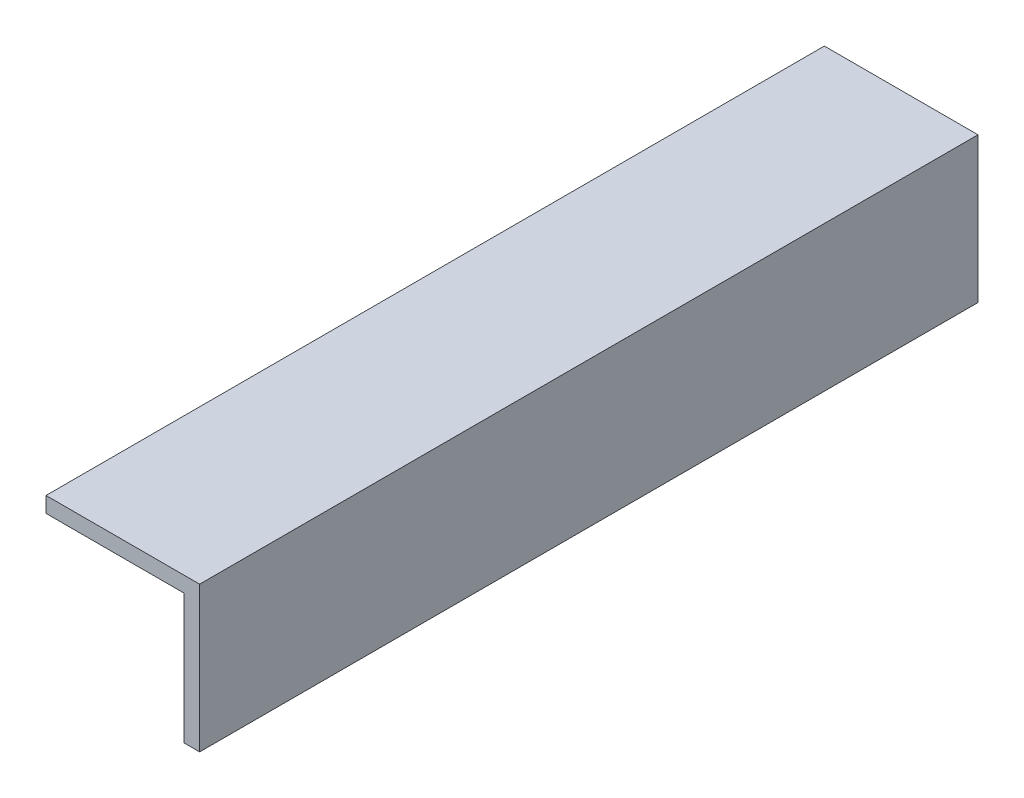
ISO-10303-21;
HEADER;
FILE_DESCRIPTION(('STEP AP214'),'2;1');
FILE_NAME('part.step','',(''),(''),'','','');
FILE_SCHEMA(('AUTOMOTIVE_DESIGN { 1 0 10303 214 1 1 1 1 }'));
ENDSEC;
DATA;
#1=APPLICATION_CONTEXT('core data for automotive mechanical design processes');
#2=APPLICATION_PROTOCOL_DEFINITION('international standard','automotive_design',2000,#1);
#3=PRODUCT_CONTEXT('',#1,'mechanical');
#4=PRODUCT('Part','Part','',(#3));
#5=PRODUCT_RELATED_PRODUCT_CATEGORY('part','',(#4));
#6=PRODUCT_DEFINITION_FORMATION('','',#4);
#7=PRODUCT_DEFINITION_CONTEXT('part definition',#1,'design');
#8=PRODUCT_DEFINITION('design','',#6,#7);
#9=PRODUCT_DEFINITION_SHAPE('','',#8);
#10=(LENGTH_UNIT() NAMED_UNIT(*) SI_UNIT(.MILLI.,.METRE.));
#11=(NAMED_UNIT(*) PLANE_ANGLE_UNIT() SI_UNIT($,.RADIAN.));
#12=(NAMED_UNIT(*) SI_UNIT($,.STERADIAN.) SOLID_ANGLE_UNIT());
#13=UNCERTAINTY_MEASURE_WITH_UNIT(LENGTH_MEASURE(1.E-05),#10,'distance_accuracy_value','');
#14=(GEOMETRIC_REPRESENTATION_CONTEXT(3) GLOBAL_UNCERTAINTY_ASSIGNED_CONTEXT((#13)) GLOBAL_UNIT_ASSIGNED_CONTEXT((#10,
#11,#12)) REPRESENTATION_CONTEXT('',''));
#15=CARTESIAN_POINT('',(0.,0.,0.));
#16=DIRECTION('',(0.,0.,1.));
#17=DIRECTION('',(1.,0.,0.));
#18=AXIS2_PLACEMENT_3D('',#15,#16,#17);
#19=CARTESIAN_POINT('',(0.,0.,150.));
#20=DIRECTION('',(1.,0.,0.));
#21=DIRECTION('',(0.,1.,0.));
#22=AXIS2_PLACEMENT_3D('',#19,#20,#21);
#23=PLANE('',#22);
#24=DIRECTION('',(0.,-1.,0.));
#25=VECTOR('',#24,1.);
#26=CARTESIAN_POINT('',(0.,0.,0.));
#27=LINE('',#26,#25);
#28=CARTESIAN_POINT('',(0.,0.,0.));
#29=VERTEX_POINT('',#28);
#30=CARTESIAN_POINT('',(0.,-3.,0.));
#31=VERTEX_POINT('',#30);
#32=EDGE_CURVE('E117',#29,#31,#27,.T.);
#33=ORIENTED_EDGE('',*,*,#32,.T.);
#34=DIRECTION('',(0.,0.,-1.));
#35=VECTOR('',#34,1.);
#36=CARTESIAN_POINT('',(0.,-3.,150.));
#37=LINE('',#36,#35);
#38=CARTESIAN_POINT('',(0.,-3.,150.));
#39=VERTEX_POINT('',#38);
#40=EDGE_CURVE('E11',#39,#31,#37,.T.);
#41=ORIENTED_EDGE('',*,*,#40,.F.);
#42=DIRECTION('',(0.,-1.,0.));
#43=VECTOR('',#42,1.);
#44=CARTESIAN_POINT('',(0.,0.,150.));
#45=LINE('',#44,#43);
#46=CARTESIAN_POINT('',(0.,0.,150.));
#47=VERTEX_POINT('',#46);
#48=EDGE_CURVE('E127',#47,#39,#45,.T.);
#49=ORIENTED_EDGE('',*,*,#48,.F.);
#50=DIRECTION('',(0.,0.,-1.));
#51=VECTOR('',#50,1.);
#52=CARTESIAN_POINT('',(0.,0.,150.));
#53=LINE('',#52,#51);
#54=EDGE_CURVE('E113',#47,#29,#53,.T.);
#55=ORIENTED_EDGE('',*,*,#54,.T.);
#56=EDGE_LOOP('',(#33,#41,#49,#55));
#57=FACE_BOUND('',#56,.T.);
#58=ADVANCED_FACE('F33',(#57),#23,.F.);
#59=CARTESIAN_POINT('',(0.,-3.,150.));
#60=DIRECTION('',(0.,1.,0.));
#61=DIRECTION('',(0.,0.,1.));
#62=AXIS2_PLACEMENT_3D('',#59,#60,#61);
#63=PLANE('',#62);
#64=DIRECTION('',(1.,0.,0.));
#65=VECTOR('',#64,1.);
#66=CARTESIAN_POINT('',(0.,-3.,0.));
#67=LINE('',#66,#65);
#68=CARTESIAN_POINT('',(26.6072371518082,-3.,0.));
#69=VERTEX_POINT('',#68);
#70=EDGE_CURVE('E120',#31,#69,#67,.T.);
#71=ORIENTED_EDGE('',*,*,#70,.T.);
#72=DIRECTION('',(0.,0.,-1.));
#73=VECTOR('',#72,1.);
#74=CARTESIAN_POINT('',(26.6072371518082,-3.,150.));
#75=LINE('',#74,#73);
#76=CARTESIAN_POINT('',(26.6072371518082,-3.,150.));
#77=VERTEX_POINT('',#76);
#78=EDGE_CURVE('E41',#77,#69,#75,.T.);
#79=ORIENTED_EDGE('',*,*,#78,.F.);
#80=DIRECTION('',(1.,0.,0.));
#81=VECTOR('',#80,1.);
#82=CARTESIAN_POINT('',(0.,-3.,150.));
#83=LINE('',#82,#81);
#84=EDGE_CURVE('E86',#39,#77,#83,.T.);
#85=ORIENTED_EDGE('',*,*,#84,.F.);
#86=ORIENTED_EDGE('',*,*,#40,.T.);
#87=EDGE_LOOP('',(#71,#79,#85,#86));
#88=FACE_BOUND('',#87,.T.);
#89=ADVANCED_FACE('F151',(#88),#63,.F.);
#90=CARTESIAN_POINT('',(26.6072371518081,-28.,150.));
#91=DIRECTION('',(1.,0.,0.));
#92=DIRECTION('',(0.,1.,0.));
#93=AXIS2_PLACEMENT_3D('',#90,#91,#92);
#94=PLANE('',#93);
#95=DIRECTION('',(0.,-1.,0.));
#96=VECTOR('',#95,1.);
#97=CARTESIAN_POINT('',(26.6072371518081,-28.,0.));
#98=LINE('',#97,#96);
#99=CARTESIAN_POINT('',(26.6072371518081,-28.,0.));
#100=VERTEX_POINT('',#99);
#101=EDGE_CURVE('E122',#69,#100,#98,.T.);
#102=ORIENTED_EDGE('',*,*,#101,.T.);
#103=DIRECTION('',(0.,0.,-1.));
#104=VECTOR('',#103,1.);
#105=CARTESIAN_POINT('',(26.6072371518081,-28.,150.));
#106=LINE('',#105,#104);
#107=CARTESIAN_POINT('',(26.6072371518081,-28.,150.));
#108=VERTEX_POINT('',#107);
#109=EDGE_CURVE('E108',#108,#100,#106,.T.);
#110=ORIENTED_EDGE('',*,*,#109,.F.);
#111=DIRECTION('',(0.,-1.,0.));
#112=VECTOR('',#111,1.);
#113=CARTESIAN_POINT('',(26.6072371518081,-28.,150.));
#114=LINE('',#113,#112);
#115=EDGE_CURVE('E99',#77,#108,#114,.T.);
#116=ORIENTED_EDGE('',*,*,#115,.F.);
#117=ORIENTED_EDGE('',*,*,#78,.T.);
#118=EDGE_LOOP('',(#102,#110,#116,#117));
#119=FACE_BOUND('',#118,.T.);
#120=ADVANCED_FACE('F133',(#119),#94,.F.);
#121=CARTESIAN_POINT('',(29.6072371518081,-28.,150.));
#122=DIRECTION('',(0.,1.,0.));
#123=DIRECTION('',(-1.,0.,0.));
#124=AXIS2_PLACEMENT_3D('',#121,#122,#123);
#125=PLANE('',#124);
#126=DIRECTION('',(1.,0.,0.));
#127=VECTOR('',#126,1.);
#128=CARTESIAN_POINT('',(29.6072371518081,-28.,0.));
#129=LINE('',#128,#127);
#130=CARTESIAN_POINT('',(29.6072371518081,-28.,0.));
#131=VERTEX_POINT('',#130);
#132=EDGE_CURVE('E107',#100,#131,#129,.T.);
#133=ORIENTED_EDGE('',*,*,#132,.T.);
#134=DIRECTION('',(0.,0.,-1.));
#135=VECTOR('',#134,1.);
#136=CARTESIAN_POINT('',(29.6072371518081,-28.,150.));
#137=LINE('',#136,#135);
#138=CARTESIAN_POINT('',(29.6072371518081,-28.,150.));
#139=VERTEX_POINT('',#138);
#140=EDGE_CURVE('E104',#139,#131,#137,.T.);
#141=ORIENTED_EDGE('',*,*,#140,.F.);
#142=DIRECTION('',(1.,0.,0.));
#143=VECTOR('',#142,1.);
#144=CARTESIAN_POINT('',(29.6072371518081,-28.,150.));
#145=LINE('',#144,#143);
#146=EDGE_CURVE('E93',#108,#139,#145,.T.);
#147=ORIENTED_EDGE('',*,*,#146,.F.);
#148=ORIENTED_EDGE('',*,*,#109,.T.);
#149=EDGE_LOOP('',(#133,#141,#147,#148));
#150=FACE_BOUND('',#149,.T.);
#151=ADVANCED_FACE('F105',(#150),#125,.F.);
#152=CARTESIAN_POINT('',(29.6072371518082,0.,150.));
#153=DIRECTION('',(-1.,0.,0.));
#154=DIRECTION('',(0.,-1.,0.));
#155=AXIS2_PLACEMENT_3D('',#152,#153,#154);
#156=PLANE('',#155);
#157=DIRECTION('',(0.,1.,0.));
#158=VECTOR('',#157,1.);
#159=CARTESIAN_POINT('',(29.6072371518082,0.,0.));
#160=LINE('',#159,#158);
#161=CARTESIAN_POINT('',(29.6072371518082,0.,0.));
#162=VERTEX_POINT('',#161);
#163=EDGE_CURVE('E72',#131,#162,#160,.T.);
#164=ORIENTED_EDGE('',*,*,#163,.T.);
#165=DIRECTION('',(0.,0.,-1.));
#166=VECTOR('',#165,1.);
#167=CARTESIAN_POINT('',(29.6072371518082,0.,150.));
#168=LINE('',#167,#166);
#169=CARTESIAN_POINT('',(29.6072371518082,0.,150.));
#170=VERTEX_POINT('',#169);
#171=EDGE_CURVE('E109',#170,#162,#168,.T.);
#172=ORIENTED_EDGE('',*,*,#171,.F.);
#173=DIRECTION('',(0.,1.,0.));
#174=VECTOR('',#173,1.);
#175=CARTESIAN_POINT('',(29.6072371518082,0.,150.));
#176=LINE('',#175,#174);
#177=EDGE_CURVE('E97',#139,#170,#176,.T.);
#178=ORIENTED_EDGE('',*,*,#177,.F.);
#179=ORIENTED_EDGE('',*,*,#140,.T.);
#180=EDGE_LOOP('',(#164,#172,#178,#179));
#181=FACE_BOUND('',#180,.T.);
#182=ADVANCED_FACE('F111',(#181),#156,.F.);
#183=CARTESIAN_POINT('',(0.,0.,150.));
#184=DIRECTION('',(0.,-1.,0.));
#185=DIRECTION('',(0.,0.,-1.));
#186=AXIS2_PLACEMENT_3D('',#183,#184,#185);
#187=PLANE('',#186);
#188=DIRECTION('',(-1.,0.,0.));
#189=VECTOR('',#188,1.);
#190=CARTESIAN_POINT('',(0.,0.,0.));
#191=LINE('',#190,#189);
#192=EDGE_CURVE('E78',#162,#29,#191,.T.);
#193=ORIENTED_EDGE('',*,*,#192,.T.);
#194=ORIENTED_EDGE('',*,*,#54,.F.);
#195=DIRECTION('',(-1.,0.,0.));
#196=VECTOR('',#195,1.);
#197=CARTESIAN_POINT('',(0.,0.,150.));
#198=LINE('',#197,#196);
#199=EDGE_CURVE('E49',#170,#47,#198,.T.);
#200=ORIENTED_EDGE('',*,*,#199,.F.);
#201=ORIENTED_EDGE('',*,*,#171,.T.);
#202=EDGE_LOOP('',(#193,#194,#200,#201));
#203=FACE_BOUND('',#202,.T.);
#204=ADVANCED_FACE('F140',(#203),#187,.F.);
#205=CARTESIAN_POINT('',(0.,0.,150.));
#206=DIRECTION('',(0.,0.,1.));
#207=DIRECTION('',(1.,0.,0.));
#208=AXIS2_PLACEMENT_3D('',#205,#206,#207);
#209=PLANE('',#208);
#210=ORIENTED_EDGE('',*,*,#48,.T.);
#211=ORIENTED_EDGE('',*,*,#84,.T.);
#212=ORIENTED_EDGE('',*,*,#115,.T.);
#213=ORIENTED_EDGE('',*,*,#146,.T.);
#214=ORIENTED_EDGE('',*,*,#177,.T.);
#215=ORIENTED_EDGE('',*,*,#199,.T.);
#216=EDGE_LOOP('',(#210,#211,#212,#213,#214,#215));
#217=FACE_BOUND('',#216,.T.);
#218=ADVANCED_FACE('F95',(#217),#209,.T.);
#219=CARTESIAN_POINT('',(0.,0.,0.));
#220=DIRECTION('',(0.,0.,1.));
#221=DIRECTION('',(1.,0.,0.));
#222=AXIS2_PLACEMENT_3D('',#219,#220,#221);
#223=PLANE('',#222);
#224=ORIENTED_EDGE('',*,*,#32,.F.);
#225=ORIENTED_EDGE('',*,*,#192,.F.);
#226=ORIENTED_EDGE('',*,*,#163,.F.);
#227=ORIENTED_EDGE('',*,*,#132,.F.);
#228=ORIENTED_EDGE('',*,*,#101,.F.);
#229=ORIENTED_EDGE('',*,*,#70,.F.);
#230=EDGE_LOOP('',(#224,#225,#226,#227,#228,#229));
#231=FACE_BOUND('',#230,.T.);
#232=ADVANCED_FACE('F136',(#231),#223,.F.);
#233=CLOSED_SHELL('',(#58,#89,#120,#151,#182,#204,#218,#232));
#234=MANIFOLD_SOLID_BREP('B2',#233);
#235=ADVANCED_BREP_SHAPE_REPRESENTATION('',(#18,#234),#14);
#236=SHAPE_DEFINITION_REPRESENTATION(#9,#235);
ENDSEC;
END-ISO-10303-21;
